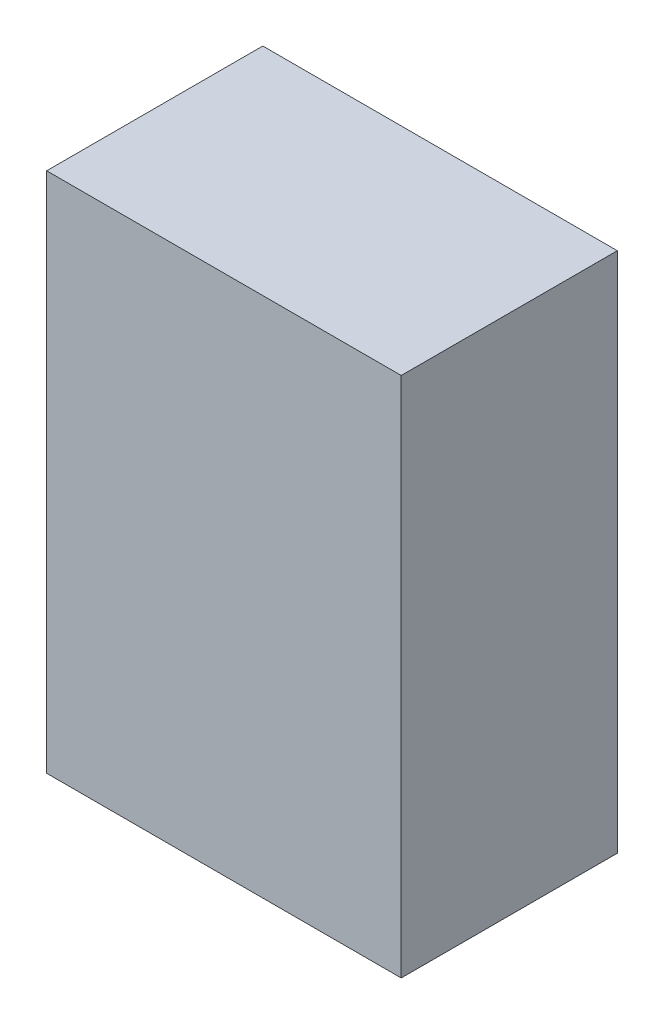
ISO-10303-21;
HEADER;
FILE_DESCRIPTION(('STEP AP214'),'2;1');
FILE_NAME('part.step','',(''),(''),'','','');
FILE_SCHEMA(('AUTOMOTIVE_DESIGN { 1 0 10303 214 1 1 1 1 }'));
ENDSEC;
DATA;
#1=APPLICATION_CONTEXT('core data for automotive mechanical design processes');
#2=APPLICATION_PROTOCOL_DEFINITION('international standard','automotive_design',2000,#1);
#3=PRODUCT_CONTEXT('',#1,'mechanical');
#4=PRODUCT('Part','Part','',(#3));
#5=PRODUCT_RELATED_PRODUCT_CATEGORY('part','',(#4));
#6=PRODUCT_DEFINITION_FORMATION('','',#4);
#7=PRODUCT_DEFINITION_CONTEXT('part definition',#1,'design');
#8=PRODUCT_DEFINITION('design','',#6,#7);
#9=PRODUCT_DEFINITION_SHAPE('','',#8);
#10=(LENGTH_UNIT() NAMED_UNIT(*) SI_UNIT(.MILLI.,.METRE.));
#11=(NAMED_UNIT(*) PLANE_ANGLE_UNIT() SI_UNIT($,.RADIAN.));
#12=(NAMED_UNIT(*) SI_UNIT($,.STERADIAN.) SOLID_ANGLE_UNIT());
#13=UNCERTAINTY_MEASURE_WITH_UNIT(LENGTH_MEASURE(1.E-05),#10,'distance_accuracy_value','');
#14=(GEOMETRIC_REPRESENTATION_CONTEXT(3) GLOBAL_UNCERTAINTY_ASSIGNED_CONTEXT((#13)) GLOBAL_UNIT_ASSIGNED_CONTEXT((#10,
#11,#12)) REPRESENTATION_CONTEXT('',''));
#15=CARTESIAN_POINT('',(0.,0.,0.));
#16=DIRECTION('',(0.,0.,1.));
#17=DIRECTION('',(1.,0.,0.));
#18=AXIS2_PLACEMENT_3D('',#15,#16,#17);
#19=CARTESIAN_POINT('',(-74.0908440860215,55.3292114695341,50.));
#20=DIRECTION('',(0.,-1.,0.));
#21=DIRECTION('',(0.,0.,-1.));
#22=AXIS2_PLACEMENT_3D('',#19,#20,#21);
#23=PLANE('',#22);
#24=DIRECTION('',(-1.,0.,0.));
#25=VECTOR('',#24,1.);
#26=CARTESIAN_POINT('',(-74.0908440860215,55.3292114695341,0.));
#27=LINE('',#26,#25);
#28=CARTESIAN_POINT('',(7.93567921146954,55.3292114695341,0.));
#29=VERTEX_POINT('',#28);
#30=CARTESIAN_POINT('',(-74.0908440860215,55.3292114695341,0.));
#31=VERTEX_POINT('',#30);
#32=EDGE_CURVE('E96',#29,#31,#27,.T.);
#33=ORIENTED_EDGE('',*,*,#32,.T.);
#34=DIRECTION('',(0.,0.,-1.));
#35=VECTOR('',#34,1.);
#36=CARTESIAN_POINT('',(-74.0908440860215,55.3292114695341,50.));
#37=LINE('',#36,#35);
#38=CARTESIAN_POINT('',(-74.0908440860215,55.3292114695341,50.));
#39=VERTEX_POINT('',#38);
#40=EDGE_CURVE('E11',#39,#31,#37,.T.);
#41=ORIENTED_EDGE('',*,*,#40,.F.);
#42=DIRECTION('',(-1.,0.,0.));
#43=VECTOR('',#42,1.);
#44=CARTESIAN_POINT('',(-74.0908440860215,55.3292114695341,50.));
#45=LINE('',#44,#43);
#46=CARTESIAN_POINT('',(7.93567921146954,55.3292114695341,50.));
#47=VERTEX_POINT('',#46);
#48=EDGE_CURVE('E84',#47,#39,#45,.T.);
#49=ORIENTED_EDGE('',*,*,#48,.F.);
#50=DIRECTION('',(0.,0.,-1.));
#51=VECTOR('',#50,1.);
#52=CARTESIAN_POINT('',(7.93567921146954,55.3292114695341,50.));
#53=LINE('',#52,#51);
#54=EDGE_CURVE('E92',#47,#29,#53,.T.);
#55=ORIENTED_EDGE('',*,*,#54,.T.);
#56=EDGE_LOOP('',(#33,#41,#49,#55));
#57=FACE_BOUND('',#56,.T.);
#58=ADVANCED_FACE('F33',(#57),#23,.F.);
#59=CARTESIAN_POINT('',(-74.0908440860215,55.3292114695341,50.));
#60=DIRECTION('',(1.,0.,0.));
#61=DIRECTION('',(0.,0.,-1.));
#62=AXIS2_PLACEMENT_3D('',#59,#60,#61);
#63=PLANE('',#62);
#64=DIRECTION('',(0.,-1.,0.));
#65=VECTOR('',#64,1.);
#66=CARTESIAN_POINT('',(-74.0908440860215,55.3292114695341,0.));
#67=LINE('',#66,#65);
#68=CARTESIAN_POINT('',(-74.0908440860215,-65.3890681003584,0.));
#69=VERTEX_POINT('',#68);
#70=EDGE_CURVE('E88',#31,#69,#67,.T.);
#71=ORIENTED_EDGE('',*,*,#70,.T.);
#72=DIRECTION('',(0.,0.,-1.));
#73=VECTOR('',#72,1.);
#74=CARTESIAN_POINT('',(-74.0908440860215,-65.3890681003584,50.));
#75=LINE('',#74,#73);
#76=CARTESIAN_POINT('',(-74.0908440860215,-65.3890681003584,50.));
#77=VERTEX_POINT('',#76);
#78=EDGE_CURVE('E41',#77,#69,#75,.T.);
#79=ORIENTED_EDGE('',*,*,#78,.F.);
#80=DIRECTION('',(0.,-1.,0.));
#81=VECTOR('',#80,1.);
#82=CARTESIAN_POINT('',(-74.0908440860215,55.3292114695341,50.));
#83=LINE('',#82,#81);
#84=EDGE_CURVE('E79',#39,#77,#83,.T.);
#85=ORIENTED_EDGE('',*,*,#84,.F.);
#86=ORIENTED_EDGE('',*,*,#40,.T.);
#87=EDGE_LOOP('',(#71,#79,#85,#86));
#88=FACE_BOUND('',#87,.T.);
#89=ADVANCED_FACE('F87',(#88),#63,.F.);
#90=CARTESIAN_POINT('',(-74.0908440860215,-65.3890681003584,50.));
#91=DIRECTION('',(0.,1.,0.));
#92=DIRECTION('',(0.,0.,1.));
#93=AXIS2_PLACEMENT_3D('',#90,#91,#92);
#94=PLANE('',#93);
#95=DIRECTION('',(1.,0.,0.));
#96=VECTOR('',#95,1.);
#97=CARTESIAN_POINT('',(-74.0908440860215,-65.3890681003584,0.));
#98=LINE('',#97,#96);
#99=CARTESIAN_POINT('',(7.93567921146954,-65.3890681003584,0.));
#100=VERTEX_POINT('',#99);
#101=EDGE_CURVE('E66',#69,#100,#98,.T.);
#102=ORIENTED_EDGE('',*,*,#101,.T.);
#103=DIRECTION('',(0.,0.,-1.));
#104=VECTOR('',#103,1.);
#105=CARTESIAN_POINT('',(7.93567921146954,-65.3890681003584,50.));
#106=LINE('',#105,#104);
#107=CARTESIAN_POINT('',(7.93567921146954,-65.3890681003584,50.));
#108=VERTEX_POINT('',#107);
#109=EDGE_CURVE('E89',#108,#100,#106,.T.);
#110=ORIENTED_EDGE('',*,*,#109,.F.);
#111=DIRECTION('',(1.,0.,0.));
#112=VECTOR('',#111,1.);
#113=CARTESIAN_POINT('',(-74.0908440860215,-65.3890681003584,50.));
#114=LINE('',#113,#112);
#115=EDGE_CURVE('E82',#77,#108,#114,.T.);
#116=ORIENTED_EDGE('',*,*,#115,.F.);
#117=ORIENTED_EDGE('',*,*,#78,.T.);
#118=EDGE_LOOP('',(#102,#110,#116,#117));
#119=FACE_BOUND('',#118,.T.);
#120=ADVANCED_FACE('F90',(#119),#94,.F.);
#121=CARTESIAN_POINT('',(7.93567921146954,55.3292114695341,50.));
#122=DIRECTION('',(-1.,0.,0.));
#123=DIRECTION('',(0.,0.,1.));
#124=AXIS2_PLACEMENT_3D('',#121,#122,#123);
#125=PLANE('',#124);
#126=DIRECTION('',(0.,1.,0.));
#127=VECTOR('',#126,1.);
#128=CARTESIAN_POINT('',(7.93567921146954,55.3292114695341,0.));
#129=LINE('',#128,#127);
#130=EDGE_CURVE('E72',#100,#29,#129,.T.);
#131=ORIENTED_EDGE('',*,*,#130,.T.);
#132=ORIENTED_EDGE('',*,*,#54,.F.);
#133=DIRECTION('',(0.,1.,0.));
#134=VECTOR('',#133,1.);
#135=CARTESIAN_POINT('',(7.93567921146954,55.3292114695341,50.));
#136=LINE('',#135,#134);
#137=EDGE_CURVE('E49',#108,#47,#136,.T.);
#138=ORIENTED_EDGE('',*,*,#137,.F.);
#139=ORIENTED_EDGE('',*,*,#109,.T.);
#140=EDGE_LOOP('',(#131,#132,#138,#139));
#141=FACE_BOUND('',#140,.T.);
#142=ADVANCED_FACE('F103',(#141),#125,.F.);
#143=CARTESIAN_POINT('',(0.,0.,50.));
#144=DIRECTION('',(0.,0.,-1.));
#145=DIRECTION('',(-1.,0.,0.));
#146=AXIS2_PLACEMENT_3D('',#143,#144,#145);
#147=PLANE('',#146);
#148=ORIENTED_EDGE('',*,*,#48,.T.);
#149=ORIENTED_EDGE('',*,*,#84,.T.);
#150=ORIENTED_EDGE('',*,*,#115,.T.);
#151=ORIENTED_EDGE('',*,*,#137,.T.);
#152=EDGE_LOOP('',(#148,#149,#150,#151));
#153=FACE_BOUND('',#152,.T.);
#154=ADVANCED_FACE('F80',(#153),#147,.F.);
#155=CARTESIAN_POINT('',(0.,0.,0.));
#156=DIRECTION('',(0.,0.,-1.));
#157=DIRECTION('',(-1.,0.,0.));
#158=AXIS2_PLACEMENT_3D('',#155,#156,#157);
#159=PLANE('',#158);
#160=ORIENTED_EDGE('',*,*,#32,.F.);
#161=ORIENTED_EDGE('',*,*,#130,.F.);
#162=ORIENTED_EDGE('',*,*,#101,.F.);
#163=ORIENTED_EDGE('',*,*,#70,.F.);
#164=EDGE_LOOP('',(#160,#161,#162,#163));
#165=FACE_BOUND('',#164,.T.);
#166=ADVANCED_FACE('F106',(#165),#159,.T.);
#167=CLOSED_SHELL('',(#58,#89,#120,#142,#154,#166));
#168=MANIFOLD_SOLID_BREP('B2',#167);
#169=ADVANCED_BREP_SHAPE_REPRESENTATION('',(#18,#168),#14);
#170=SHAPE_DEFINITION_REPRESENTATION(#9,#169);
ENDSEC;
END-ISO-10303-21;
